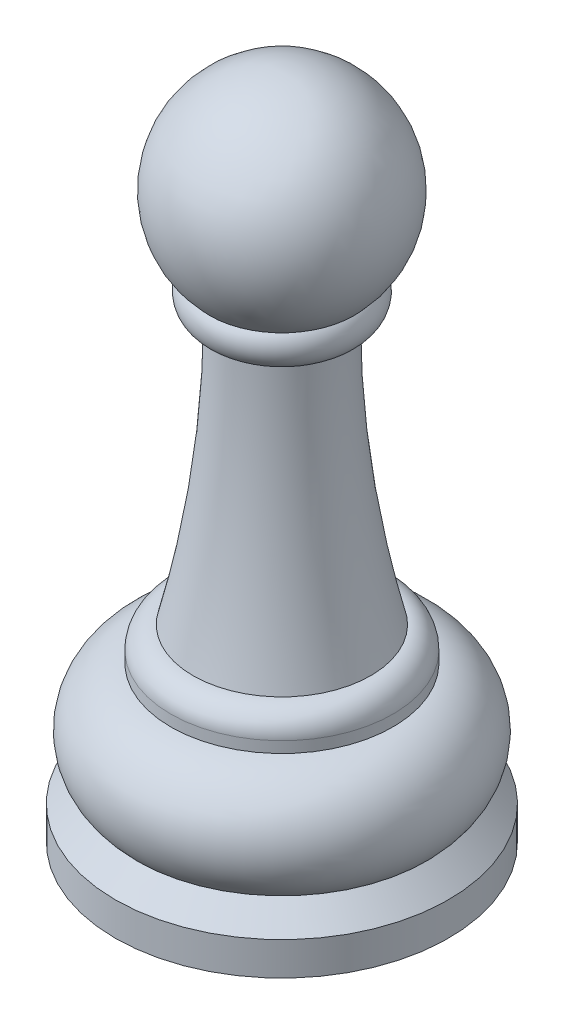
ISO-10303-21;
HEADER;
FILE_DESCRIPTION(('STEP AP214'),'2;1');
FILE_NAME('part.step','',(''),(''),'','','');
FILE_SCHEMA(('AUTOMOTIVE_DESIGN { 1 0 10303 214 1 1 1 1 }'));
ENDSEC;
DATA;
#1=APPLICATION_CONTEXT('core data for automotive mechanical design processes');
#2=APPLICATION_PROTOCOL_DEFINITION('international standard','automotive_design',2000,#1);
#3=PRODUCT_CONTEXT('',#1,'mechanical');
#4=PRODUCT('Part','Part','',(#3));
#5=PRODUCT_RELATED_PRODUCT_CATEGORY('part','',(#4));
#6=PRODUCT_DEFINITION_FORMATION('','',#4);
#7=PRODUCT_DEFINITION_CONTEXT('part definition',#1,'design');
#8=PRODUCT_DEFINITION('design','',#6,#7);
#9=PRODUCT_DEFINITION_SHAPE('','',#8);
#10=(LENGTH_UNIT() NAMED_UNIT(*) SI_UNIT(.MILLI.,.METRE.));
#11=(NAMED_UNIT(*) PLANE_ANGLE_UNIT() SI_UNIT($,.RADIAN.));
#12=(NAMED_UNIT(*) SI_UNIT($,.STERADIAN.) SOLID_ANGLE_UNIT());
#13=UNCERTAINTY_MEASURE_WITH_UNIT(LENGTH_MEASURE(1.E-05),#10,'distance_accuracy_value','');
#14=(GEOMETRIC_REPRESENTATION_CONTEXT(3) GLOBAL_UNCERTAINTY_ASSIGNED_CONTEXT((#13)) GLOBAL_UNIT_ASSIGNED_CONTEXT((#10,
#11,#12)) REPRESENTATION_CONTEXT('',''));
#15=CARTESIAN_POINT('',(0.,0.,0.));
#16=DIRECTION('',(0.,0.,1.));
#17=DIRECTION('',(1.,0.,0.));
#18=AXIS2_PLACEMENT_3D('',#15,#16,#17);
#19=CARTESIAN_POINT('',(0.,0.,0.));
#20=DIRECTION('',(0.,1.,0.));
#21=DIRECTION('',(0.,0.,1.));
#22=AXIS2_PLACEMENT_3D('',#19,#20,#21);
#23=PLANE('',#22);
#24=CARTESIAN_POINT('',(0.,0.,0.));
#25=DIRECTION('',(0.,1.,0.));
#26=DIRECTION('',(0.,0.,1.));
#27=AXIS2_PLACEMENT_3D('',#24,#25,#26);
#28=CIRCLE('',#27,15.);
#29=CARTESIAN_POINT('',(0.,0.,15.));
#30=VERTEX_POINT('',#29);
#31=EDGE_CURVE('E10',#30,#30,#28,.T.);
#32=ORIENTED_EDGE('',*,*,#31,.F.);
#33=EDGE_LOOP('',(#32));
#34=FACE_BOUND('',#33,.T.);
#35=ADVANCED_FACE('F41',(#34),#23,.F.);
#36=CARTESIAN_POINT('',(0.,60.,0.));
#37=DIRECTION('',(0.,1.,0.));
#38=DIRECTION('',(0.,0.,1.));
#39=AXIS2_PLACEMENT_3D('',#36,#37,#38);
#40=CYLINDRICAL_SURFACE('',#39,15.);
#41=CARTESIAN_POINT('',(0.,3.,0.));
#42=DIRECTION('',(0.,1.,0.));
#43=DIRECTION('',(0.,0.,1.));
#44=AXIS2_PLACEMENT_3D('',#41,#42,#43);
#45=CIRCLE('',#44,15.);
#46=CARTESIAN_POINT('',(0.,3.,15.));
#47=VERTEX_POINT('',#46);
#48=EDGE_CURVE('E48',#47,#47,#45,.T.);
#49=ORIENTED_EDGE('',*,*,#48,.F.);
#50=EDGE_LOOP('',(#49));
#51=FACE_BOUND('',#50,.T.);
#52=ORIENTED_EDGE('',*,*,#31,.T.);
#53=EDGE_LOOP('',(#52));
#54=FACE_BOUND('',#53,.T.);
#55=ADVANCED_FACE('F115',(#51,#54),#40,.T.);
#56=CARTESIAN_POINT('',(0.,3.,0.));
#57=DIRECTION('',(0.,-1.,0.));
#58=DIRECTION('',(0.,0.,-1.));
#59=AXIS2_PLACEMENT_3D('',#56,#57,#58);
#60=CONICAL_SURFACE('',#59,15.,0.785398163397455);
#61=CARTESIAN_POINT('',(0.,4.99999999999999,0.));
#62=DIRECTION('',(0.,1.,0.));
#63=DIRECTION('',(0.,0.,1.));
#64=AXIS2_PLACEMENT_3D('',#61,#62,#63);
#65=CIRCLE('',#64,13.);
#66=CARTESIAN_POINT('',(0.,4.99999999999999,13.));
#67=VERTEX_POINT('',#66);
#68=EDGE_CURVE('E53',#67,#67,#65,.T.);
#69=ORIENTED_EDGE('',*,*,#68,.F.);
#70=EDGE_LOOP('',(#69));
#71=FACE_BOUND('',#70,.T.);
#72=ORIENTED_EDGE('',*,*,#48,.T.);
#73=EDGE_LOOP('',(#72));
#74=FACE_BOUND('',#73,.T.);
#75=ADVANCED_FACE('F110',(#71,#74),#60,.T.);
#76=CARTESIAN_POINT('',(0.,8.73687969924811,0.));
#77=DIRECTION('',(0.,1.,0.));
#78=DIRECTION('',(0.,0.,1.));
#79=AXIS2_PLACEMENT_3D('',#76,#77,#78);
#80=TOROIDAL_SURFACE('',#79,9.26312030075185,5.2847459516334);
#81=CARTESIAN_POINT('',(0.,13.97,0.));
#82=DIRECTION('',(0.,1.,0.));
#83=DIRECTION('',(0.,0.,1.));
#84=AXIS2_PLACEMENT_3D('',#81,#82,#83);
#85=CIRCLE('',#84,10.);
#86=CARTESIAN_POINT('',(0.,13.97,10.));
#87=VERTEX_POINT('',#86);
#88=EDGE_CURVE('E58',#87,#87,#85,.T.);
#89=ORIENTED_EDGE('',*,*,#88,.F.);
#90=EDGE_LOOP('',(#89));
#91=FACE_BOUND('',#90,.T.);
#92=ORIENTED_EDGE('',*,*,#68,.T.);
#93=EDGE_LOOP('',(#92));
#94=FACE_BOUND('',#93,.T.);
#95=ADVANCED_FACE('F104',(#91,#94),#80,.T.);
#96=CARTESIAN_POINT('',(0.,60.,0.));
#97=DIRECTION('',(0.,1.,0.));
#98=DIRECTION('',(0.,0.,1.));
#99=AXIS2_PLACEMENT_3D('',#96,#97,#98);
#100=CYLINDRICAL_SURFACE('',#99,10.);
#101=CARTESIAN_POINT('',(0.,14.97,0.));
#102=DIRECTION('',(0.,1.,0.));
#103=DIRECTION('',(0.,0.,1.));
#104=AXIS2_PLACEMENT_3D('',#101,#102,#103);
#105=CIRCLE('',#104,10.);
#106=CARTESIAN_POINT('',(0.,14.97,10.));
#107=VERTEX_POINT('',#106);
#108=EDGE_CURVE('E64',#107,#107,#105,.T.);
#109=ORIENTED_EDGE('',*,*,#108,.F.);
#110=EDGE_LOOP('',(#109));
#111=FACE_BOUND('',#110,.T.);
#112=ORIENTED_EDGE('',*,*,#88,.T.);
#113=EDGE_LOOP('',(#112));
#114=FACE_BOUND('',#113,.T.);
#115=ADVANCED_FACE('F98',(#111,#114),#100,.T.);
#116=CARTESIAN_POINT('',(0.,14.97,0.));
#117=DIRECTION('',(0.,1.,0.));
#118=DIRECTION('',(0.,0.,1.));
#119=AXIS2_PLACEMENT_3D('',#116,#117,#118);
#120=TOROIDAL_SURFACE('',#119,8.,2.);
#121=CARTESIAN_POINT('',(0.,16.97,0.));
#122=DIRECTION('',(0.,1.,0.));
#123=DIRECTION('',(0.,0.,1.));
#124=AXIS2_PLACEMENT_3D('',#121,#122,#123);
#125=CIRCLE('',#124,8.);
#126=CARTESIAN_POINT('',(0.,16.97,8.));
#127=VERTEX_POINT('',#126);
#128=EDGE_CURVE('E68',#127,#127,#125,.T.);
#129=ORIENTED_EDGE('',*,*,#128,.F.);
#130=EDGE_LOOP('',(#129));
#131=FACE_BOUND('',#130,.T.);
#132=ORIENTED_EDGE('',*,*,#108,.T.);
#133=EDGE_LOOP('',(#132));
#134=FACE_BOUND('',#133,.T.);
#135=ADVANCED_FACE('F92',(#131,#134),#120,.T.);
#136=CARTESIAN_POINT('',(0.,41.03,0.));
#137=DIRECTION('',(0.,1.,0.));
#138=DIRECTION('',(0.,0.,1.));
#139=AXIS2_PLACEMENT_3D('',#136,#137,#138);
#140=TOROIDAL_SURFACE('',#139,102.980600000002,97.9806000000019);
#141=CARTESIAN_POINT('',(0.,41.03,0.));
#142=DIRECTION('',(0.,1.,0.));
#143=DIRECTION('',(0.,0.,1.));
#144=AXIS2_PLACEMENT_3D('',#141,#142,#143);
#145=CIRCLE('',#144,5.00000000000003);
#146=CARTESIAN_POINT('',(0.,41.03,5.00000000000003));
#147=VERTEX_POINT('',#146);
#148=EDGE_CURVE('E72',#147,#147,#145,.T.);
#149=ORIENTED_EDGE('',*,*,#148,.F.);
#150=EDGE_LOOP('',(#149));
#151=FACE_BOUND('',#150,.T.);
#152=ORIENTED_EDGE('',*,*,#128,.T.);
#153=EDGE_LOOP('',(#152));
#154=FACE_BOUND('',#153,.T.);
#155=ADVANCED_FACE('F86',(#151,#154),#140,.F.);
#156=CARTESIAN_POINT('',(0.,43.0050920245399,0.));
#157=DIRECTION('',(0.,1.,0.));
#158=DIRECTION('',(0.,0.,1.));
#159=AXIS2_PLACEMENT_3D('',#156,#157,#158);
#160=TOROIDAL_SURFACE('',#159,5.,1.97509202453988);
#161=CARTESIAN_POINT('',(0.,44.29,0.));
#162=DIRECTION('',(0.,1.,0.));
#163=DIRECTION('',(0.,0.,1.));
#164=AXIS2_PLACEMENT_3D('',#161,#162,#163);
#165=CIRCLE('',#164,6.5);
#166=CARTESIAN_POINT('',(0.,44.29,6.5));
#167=VERTEX_POINT('',#166);
#168=EDGE_CURVE('E76',#167,#167,#165,.T.);
#169=ORIENTED_EDGE('',*,*,#168,.F.);
#170=EDGE_LOOP('',(#169));
#171=FACE_BOUND('',#170,.T.);
#172=ORIENTED_EDGE('',*,*,#148,.T.);
#173=EDGE_LOOP('',(#172));
#174=FACE_BOUND('',#173,.T.);
#175=ADVANCED_FACE('F83',(#171,#174),#160,.T.);
#176=CARTESIAN_POINT('',(0.,50.8003150859325,0.));
#177=DIRECTION('',(0.,1.,0.));
#178=DIRECTION('',(1.,0.,0.));
#179=AXIS2_PLACEMENT_3D('',#176,#177,#178);
#180=SPHERICAL_SURFACE('',#179,9.19968491406747);
#181=ORIENTED_EDGE('',*,*,#168,.T.);
#182=EDGE_LOOP('',(#181));
#183=FACE_BOUND('',#182,.T.);
#184=ADVANCED_FACE('F81',(#183),#180,.T.);
#185=CLOSED_SHELL('',(#35,#55,#75,#95,#115,#135,#155,#175,#184));
#186=MANIFOLD_SOLID_BREP('B2',#185);
#187=ADVANCED_BREP_SHAPE_REPRESENTATION('',(#18,#186),#14);
#188=SHAPE_DEFINITION_REPRESENTATION(#9,#187);
ENDSEC;
END-ISO-10303-21;
